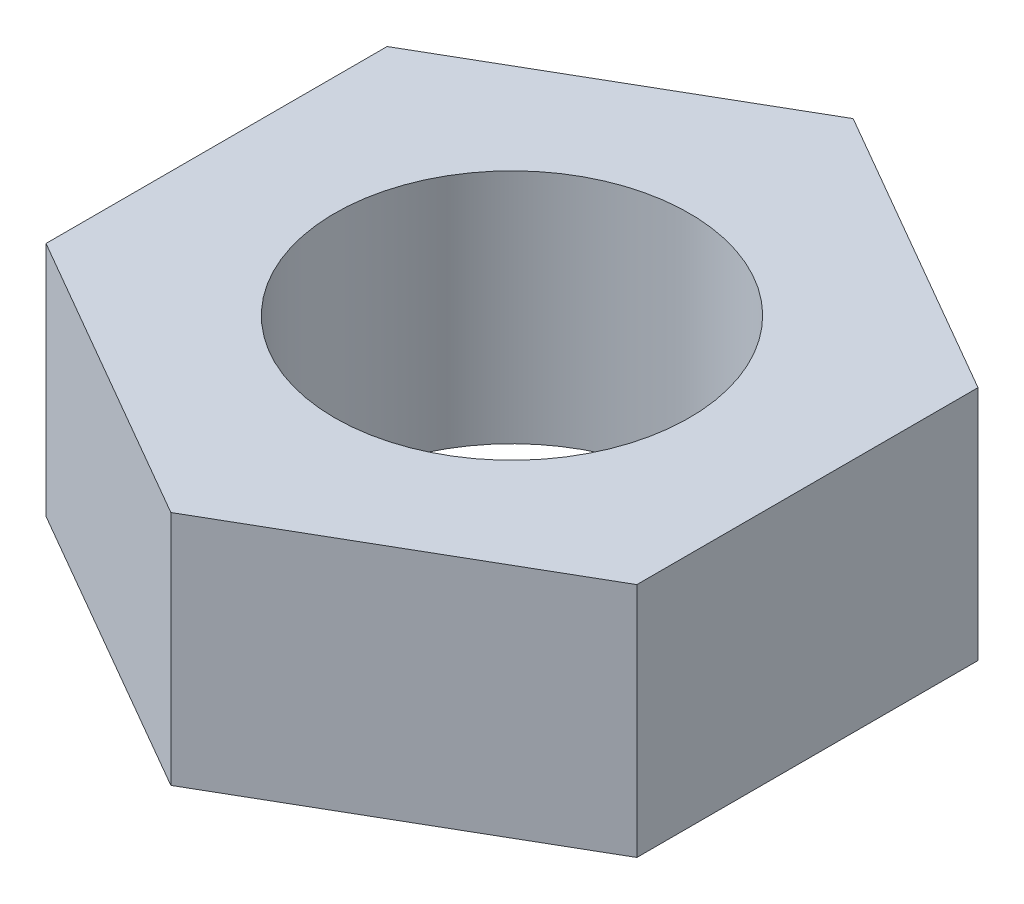
ISO-10303-21;
HEADER;
FILE_DESCRIPTION(('STEP AP214'),'2;1');
FILE_NAME('part.step','',(''),(''),'','','');
FILE_SCHEMA(('AUTOMOTIVE_DESIGN { 1 0 10303 214 1 1 1 1 }'));
ENDSEC;
DATA;
#1=APPLICATION_CONTEXT('core data for automotive mechanical design processes');
#2=APPLICATION_PROTOCOL_DEFINITION('international standard','automotive_design',2000,#1);
#3=PRODUCT_CONTEXT('',#1,'mechanical');
#4=PRODUCT('Part','Part','',(#3));
#5=PRODUCT_RELATED_PRODUCT_CATEGORY('part','',(#4));
#6=PRODUCT_DEFINITION_FORMATION('','',#4);
#7=PRODUCT_DEFINITION_CONTEXT('part definition',#1,'design');
#8=PRODUCT_DEFINITION('design','',#6,#7);
#9=PRODUCT_DEFINITION_SHAPE('','',#8);
#10=(LENGTH_UNIT() NAMED_UNIT(*) SI_UNIT(.MILLI.,.METRE.));
#11=(NAMED_UNIT(*) PLANE_ANGLE_UNIT() SI_UNIT($,.RADIAN.));
#12=(NAMED_UNIT(*) SI_UNIT($,.STERADIAN.) SOLID_ANGLE_UNIT());
#13=UNCERTAINTY_MEASURE_WITH_UNIT(LENGTH_MEASURE(1.E-05),#10,'distance_accuracy_value','');
#14=(GEOMETRIC_REPRESENTATION_CONTEXT(3) GLOBAL_UNCERTAINTY_ASSIGNED_CONTEXT((#13)) GLOBAL_UNIT_ASSIGNED_CONTEXT((#10,
#11,#12)) REPRESENTATION_CONTEXT('',''));
#15=CARTESIAN_POINT('',(0.,0.,0.));
#16=DIRECTION('',(0.,0.,1.));
#17=DIRECTION('',(1.,0.,0.));
#18=AXIS2_PLACEMENT_3D('',#15,#16,#17);
#19=CARTESIAN_POINT('',(0.,0.,0.));
#20=DIRECTION('',(0.,1.,0.));
#21=DIRECTION('',(0.,0.,1.));
#22=AXIS2_PLACEMENT_3D('',#19,#20,#21);
#23=PLANE('',#22);
#24=CARTESIAN_POINT('',(0.,0.,0.));
#25=DIRECTION('',(0.,1.,0.));
#26=DIRECTION('',(0.,0.,1.));
#27=AXIS2_PLACEMENT_3D('',#24,#25,#26);
#28=CIRCLE('',#27,3.);
#29=CARTESIAN_POINT('',(0.,0.,3.));
#30=VERTEX_POINT('',#29);
#31=EDGE_CURVE('E160',#30,#30,#28,.F.);
#32=ORIENTED_EDGE('',*,*,#31,.F.);
#33=EDGE_LOOP('',(#32));
#34=FACE_BOUND('',#33,.T.);
#35=DIRECTION('',(0.,0.,-1.));
#36=VECTOR('',#35,1.);
#37=CARTESIAN_POINT('',(5.,0.,0.));
#38=LINE('',#37,#36);
#39=CARTESIAN_POINT('',(5.00000000000003,0.,2.88675134594809));
#40=VERTEX_POINT('',#39);
#41=CARTESIAN_POINT('',(4.99999999999997,0.,-2.88675134594819));
#42=VERTEX_POINT('',#41);
#43=EDGE_CURVE('E156',#40,#42,#38,.T.);
#44=ORIENTED_EDGE('',*,*,#43,.F.);
#45=DIRECTION('',(0.866025403784435,0.,-0.500000000000007));
#46=VECTOR('',#45,1.);
#47=CARTESIAN_POINT('',(2.50000000000004,0.,4.33012701892217));
#48=LINE('',#47,#46);
#49=CARTESIAN_POINT('',(0.,0.,5.77350269189626));
#50=VERTEX_POINT('',#49);
#51=EDGE_CURVE('E117',#50,#40,#48,.T.);
#52=ORIENTED_EDGE('',*,*,#51,.F.);
#53=DIRECTION('',(0.866025403784442,0.,0.499999999999995));
#54=VECTOR('',#53,1.);
#55=CARTESIAN_POINT('',(-2.49999999999997,0.,4.33012701892221));
#56=LINE('',#55,#54);
#57=CARTESIAN_POINT('',(-4.99999999999999,0.,2.88675134594815));
#58=VERTEX_POINT('',#57);
#59=EDGE_CURVE('E111',#58,#50,#56,.T.);
#60=ORIENTED_EDGE('',*,*,#59,.F.);
#61=DIRECTION('',(0.,0.,1.));
#62=VECTOR('',#61,1.);
#63=CARTESIAN_POINT('',(-5.,0.,0.));
#64=LINE('',#63,#62);
#65=CARTESIAN_POINT('',(-5.00000000000001,0.,-2.88675134594812));
#66=VERTEX_POINT('',#65);
#67=EDGE_CURVE('E146',#66,#58,#64,.T.);
#68=ORIENTED_EDGE('',*,*,#67,.F.);
#69=DIRECTION('',(-0.866025403784438,0.,0.500000000000001));
#70=VECTOR('',#69,1.);
#71=CARTESIAN_POINT('',(-2.50000000000001,0.,-4.33012701892219));
#72=LINE('',#71,#70);
#73=CARTESIAN_POINT('',(0.,0.,-5.77350269189626));
#74=VERTEX_POINT('',#73);
#75=EDGE_CURVE('E162',#74,#66,#72,.T.);
#76=ORIENTED_EDGE('',*,*,#75,.F.);
#77=DIRECTION('',(-0.866025403784442,0.,-0.499999999999995));
#78=VECTOR('',#77,1.);
#79=CARTESIAN_POINT('',(2.49999999999999,0.,-4.33012701892223));
#80=LINE('',#79,#78);
#81=EDGE_CURVE('E159',#42,#74,#80,.T.);
#82=ORIENTED_EDGE('',*,*,#81,.F.);
#83=EDGE_LOOP('',(#44,#52,#60,#68,#76,#82));
#84=FACE_BOUND('',#83,.T.);
#85=ADVANCED_FACE('F71',(#34,#84),#23,.F.);
#86=CARTESIAN_POINT('',(5.,4.,0.));
#87=DIRECTION('',(-1.,0.,0.));
#88=DIRECTION('',(0.,0.,1.));
#89=AXIS2_PLACEMENT_3D('',#86,#87,#88);
#90=PLANE('',#89);
#91=ORIENTED_EDGE('',*,*,#43,.T.);
#92=DIRECTION('',(0.,-1.,0.));
#93=VECTOR('',#92,1.);
#94=CARTESIAN_POINT('',(4.99999999999997,4.,-2.88675134594819));
#95=LINE('',#94,#93);
#96=CARTESIAN_POINT('',(4.99999999999997,4.,-2.88675134594819));
#97=VERTEX_POINT('',#96);
#98=EDGE_CURVE('E12',#97,#42,#95,.T.);
#99=ORIENTED_EDGE('',*,*,#98,.F.);
#100=DIRECTION('',(0.,0.,-1.));
#101=VECTOR('',#100,1.);
#102=CARTESIAN_POINT('',(5.,4.,0.));
#103=LINE('',#102,#101);
#104=CARTESIAN_POINT('',(5.00000000000003,4.,2.88675134594809));
#105=VERTEX_POINT('',#104);
#106=EDGE_CURVE('E167',#105,#97,#103,.T.);
#107=ORIENTED_EDGE('',*,*,#106,.F.);
#108=DIRECTION('',(0.,-1.,0.));
#109=VECTOR('',#108,1.);
#110=CARTESIAN_POINT('',(5.00000000000003,4.,2.88675134594809));
#111=LINE('',#110,#109);
#112=EDGE_CURVE('E152',#105,#40,#111,.T.);
#113=ORIENTED_EDGE('',*,*,#112,.T.);
#114=EDGE_LOOP('',(#91,#99,#107,#113));
#115=FACE_BOUND('',#114,.T.);
#116=ADVANCED_FACE('F73',(#115),#90,.F.);
#117=CARTESIAN_POINT('',(2.50000000000004,4.,4.33012701892217));
#118=DIRECTION('',(-0.500000000000007,0.,-0.866025403784435));
#119=DIRECTION('',(-0.866025403784435,0.,0.500000000000007));
#120=AXIS2_PLACEMENT_3D('',#117,#118,#119);
#121=PLANE('',#120);
#122=ORIENTED_EDGE('',*,*,#51,.T.);
#123=ORIENTED_EDGE('',*,*,#112,.F.);
#124=DIRECTION('',(0.866025403784435,0.,-0.500000000000007));
#125=VECTOR('',#124,1.);
#126=CARTESIAN_POINT('',(2.50000000000004,4.,4.33012701892217));
#127=LINE('',#126,#125);
#128=CARTESIAN_POINT('',(0.,4.,5.77350269189626));
#129=VERTEX_POINT('',#128);
#130=EDGE_CURVE('E88',#129,#105,#127,.T.);
#131=ORIENTED_EDGE('',*,*,#130,.F.);
#132=DIRECTION('',(0.,-1.,0.));
#133=VECTOR('',#132,1.);
#134=CARTESIAN_POINT('',(0.,4.,5.77350269189626));
#135=LINE('',#134,#133);
#136=EDGE_CURVE('E148',#129,#50,#135,.T.);
#137=ORIENTED_EDGE('',*,*,#136,.T.);
#138=EDGE_LOOP('',(#122,#123,#131,#137));
#139=FACE_BOUND('',#138,.T.);
#140=ADVANCED_FACE('F179',(#139),#121,.F.);
#141=CARTESIAN_POINT('',(-2.49999999999997,4.,4.33012701892221));
#142=DIRECTION('',(0.499999999999995,0.,-0.866025403784442));
#143=DIRECTION('',(-0.866025403784442,0.,-0.499999999999995));
#144=AXIS2_PLACEMENT_3D('',#141,#142,#143);
#145=PLANE('',#144);
#146=ORIENTED_EDGE('',*,*,#59,.T.);
#147=ORIENTED_EDGE('',*,*,#136,.F.);
#148=DIRECTION('',(0.866025403784442,0.,0.499999999999995));
#149=VECTOR('',#148,1.);
#150=CARTESIAN_POINT('',(-2.49999999999997,4.,4.33012701892221));
#151=LINE('',#150,#149);
#152=CARTESIAN_POINT('',(-4.99999999999999,4.,2.88675134594815));
#153=VERTEX_POINT('',#152);
#154=EDGE_CURVE('E136',#153,#129,#151,.T.);
#155=ORIENTED_EDGE('',*,*,#154,.F.);
#156=DIRECTION('',(0.,-1.,0.));
#157=VECTOR('',#156,1.);
#158=CARTESIAN_POINT('',(-4.99999999999999,4.,2.88675134594815));
#159=LINE('',#158,#157);
#160=EDGE_CURVE('E143',#153,#58,#159,.T.);
#161=ORIENTED_EDGE('',*,*,#160,.T.);
#162=EDGE_LOOP('',(#146,#147,#155,#161));
#163=FACE_BOUND('',#162,.T.);
#164=ADVANCED_FACE('F150',(#163),#145,.F.);
#165=CARTESIAN_POINT('',(-5.,4.,0.));
#166=DIRECTION('',(1.,0.,0.));
#167=DIRECTION('',(0.,0.,-1.));
#168=AXIS2_PLACEMENT_3D('',#165,#166,#167);
#169=PLANE('',#168);
#170=ORIENTED_EDGE('',*,*,#67,.T.);
#171=ORIENTED_EDGE('',*,*,#160,.F.);
#172=DIRECTION('',(0.,0.,1.));
#173=VECTOR('',#172,1.);
#174=CARTESIAN_POINT('',(-5.,4.,0.));
#175=LINE('',#174,#173);
#176=CARTESIAN_POINT('',(-5.00000000000001,4.,-2.88675134594812));
#177=VERTEX_POINT('',#176);
#178=EDGE_CURVE('E132',#177,#153,#175,.T.);
#179=ORIENTED_EDGE('',*,*,#178,.F.);
#180=DIRECTION('',(0.,-1.,0.));
#181=VECTOR('',#180,1.);
#182=CARTESIAN_POINT('',(-5.00000000000001,4.,-2.88675134594812));
#183=LINE('',#182,#181);
#184=EDGE_CURVE('E147',#177,#66,#183,.T.);
#185=ORIENTED_EDGE('',*,*,#184,.T.);
#186=EDGE_LOOP('',(#170,#171,#179,#185));
#187=FACE_BOUND('',#186,.T.);
#188=ADVANCED_FACE('F144',(#187),#169,.F.);
#189=CARTESIAN_POINT('',(-2.50000000000001,4.,-4.33012701892219));
#190=DIRECTION('',(0.500000000000001,0.,0.866025403784438));
#191=DIRECTION('',(0.866025403784438,0.,-0.500000000000001));
#192=AXIS2_PLACEMENT_3D('',#189,#190,#191);
#193=PLANE('',#192);
#194=ORIENTED_EDGE('',*,*,#75,.T.);
#195=ORIENTED_EDGE('',*,*,#184,.F.);
#196=DIRECTION('',(-0.866025403784438,0.,0.500000000000001));
#197=VECTOR('',#196,1.);
#198=CARTESIAN_POINT('',(-2.50000000000001,4.,-4.33012701892219));
#199=LINE('',#198,#197);
#200=CARTESIAN_POINT('',(0.,4.,-5.77350269189626));
#201=VERTEX_POINT('',#200);
#202=EDGE_CURVE('E138',#201,#177,#199,.T.);
#203=ORIENTED_EDGE('',*,*,#202,.F.);
#204=DIRECTION('',(0.,-1.,0.));
#205=VECTOR('',#204,1.);
#206=CARTESIAN_POINT('',(0.,4.,-5.77350269189626));
#207=LINE('',#206,#205);
#208=EDGE_CURVE('E80',#201,#74,#207,.T.);
#209=ORIENTED_EDGE('',*,*,#208,.T.);
#210=EDGE_LOOP('',(#194,#195,#203,#209));
#211=FACE_BOUND('',#210,.T.);
#212=ADVANCED_FACE('F173',(#211),#193,.F.);
#213=CARTESIAN_POINT('',(2.49999999999999,4.,-4.33012701892223));
#214=DIRECTION('',(-0.499999999999995,0.,0.866025403784441));
#215=DIRECTION('',(0.866025403784442,0.,0.499999999999995));
#216=AXIS2_PLACEMENT_3D('',#213,#214,#215);
#217=PLANE('',#216);
#218=ORIENTED_EDGE('',*,*,#81,.T.);
#219=ORIENTED_EDGE('',*,*,#208,.F.);
#220=DIRECTION('',(-0.866025403784442,0.,-0.499999999999995));
#221=VECTOR('',#220,1.);
#222=CARTESIAN_POINT('',(2.49999999999999,4.,-4.33012701892223));
#223=LINE('',#222,#221);
#224=EDGE_CURVE('E125',#97,#201,#223,.T.);
#225=ORIENTED_EDGE('',*,*,#224,.F.);
#226=ORIENTED_EDGE('',*,*,#98,.T.);
#227=EDGE_LOOP('',(#218,#219,#225,#226));
#228=FACE_BOUND('',#227,.T.);
#229=ADVANCED_FACE('F197',(#228),#217,.F.);
#230=CARTESIAN_POINT('',(0.,4.,0.));
#231=DIRECTION('',(0.,1.,0.));
#232=DIRECTION('',(0.,0.,1.));
#233=AXIS2_PLACEMENT_3D('',#230,#231,#232);
#234=PLANE('',#233);
#235=CARTESIAN_POINT('',(0.,4.,0.));
#236=DIRECTION('',(0.,1.,0.));
#237=DIRECTION('',(0.,0.,1.));
#238=AXIS2_PLACEMENT_3D('',#235,#236,#237);
#239=CIRCLE('',#238,3.);
#240=CARTESIAN_POINT('',(0.,4.,3.));
#241=VERTEX_POINT('',#240);
#242=EDGE_CURVE('E206',#241,#241,#239,.T.);
#243=ORIENTED_EDGE('',*,*,#242,.F.);
#244=EDGE_LOOP('',(#243));
#245=FACE_BOUND('',#244,.T.);
#246=ORIENTED_EDGE('',*,*,#106,.T.);
#247=ORIENTED_EDGE('',*,*,#224,.T.);
#248=ORIENTED_EDGE('',*,*,#202,.T.);
#249=ORIENTED_EDGE('',*,*,#178,.T.);
#250=ORIENTED_EDGE('',*,*,#154,.T.);
#251=ORIENTED_EDGE('',*,*,#130,.T.);
#252=EDGE_LOOP('',(#246,#247,#248,#249,#250,#251));
#253=FACE_BOUND('',#252,.T.);
#254=ADVANCED_FACE('F134',(#245,#253),#234,.T.);
#255=CARTESIAN_POINT('',(0.,-0.00100000000000013,0.));
#256=DIRECTION('',(0.,1.,0.));
#257=DIRECTION('',(0.,0.,1.));
#258=AXIS2_PLACEMENT_3D('',#255,#256,#257);
#259=CYLINDRICAL_SURFACE('',#258,3.);
#260=ORIENTED_EDGE('',*,*,#242,.T.);
#261=EDGE_LOOP('',(#260));
#262=FACE_BOUND('',#261,.T.);
#263=ORIENTED_EDGE('',*,*,#31,.T.);
#264=EDGE_LOOP('',(#263));
#265=FACE_BOUND('',#264,.T.);
#266=ADVANCED_FACE('F196',(#262,#265),#259,.F.);
#267=CLOSED_SHELL('',(#85,#116,#140,#164,#188,#212,#229,#254,#266));
#268=MANIFOLD_SOLID_BREP('B2',#267);
#269=ADVANCED_BREP_SHAPE_REPRESENTATION('',(#18,#268),#14);
#270=SHAPE_DEFINITION_REPRESENTATION(#9,#269);
ENDSEC;
END-ISO-10303-21;
